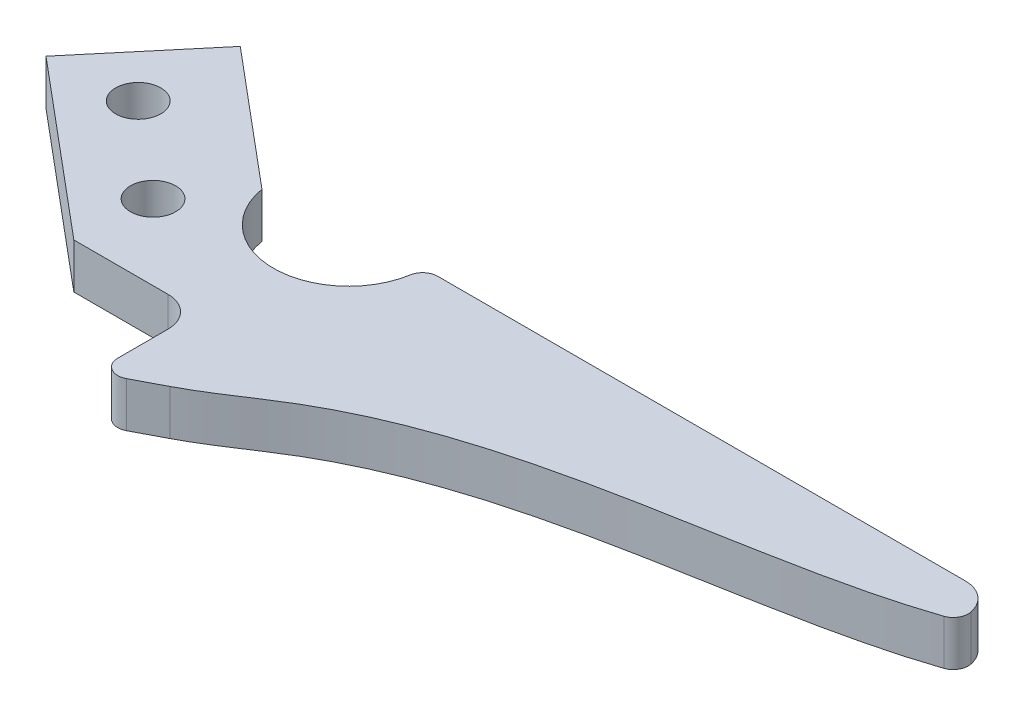
ISO-10303-21;
HEADER;
FILE_DESCRIPTION(('STEP AP214'),'2;1');
FILE_NAME('part.step','',(''),(''),'','','');
FILE_SCHEMA(('AUTOMOTIVE_DESIGN { 1 0 10303 214 1 1 1 1 }'));
ENDSEC;
DATA;
#1=APPLICATION_CONTEXT('core data for automotive mechanical design processes');
#2=APPLICATION_PROTOCOL_DEFINITION('international standard','automotive_design',2000,#1);
#3=PRODUCT_CONTEXT('',#1,'mechanical');
#4=PRODUCT('Part','Part','',(#3));
#5=PRODUCT_RELATED_PRODUCT_CATEGORY('part','',(#4));
#6=PRODUCT_DEFINITION_FORMATION('','',#4);
#7=PRODUCT_DEFINITION_CONTEXT('part definition',#1,'design');
#8=PRODUCT_DEFINITION('design','',#6,#7);
#9=PRODUCT_DEFINITION_SHAPE('','',#8);
#10=(LENGTH_UNIT() NAMED_UNIT(*) SI_UNIT(.MILLI.,.METRE.));
#11=(NAMED_UNIT(*) PLANE_ANGLE_UNIT() SI_UNIT($,.RADIAN.));
#12=(NAMED_UNIT(*) SI_UNIT($,.STERADIAN.) SOLID_ANGLE_UNIT());
#13=UNCERTAINTY_MEASURE_WITH_UNIT(LENGTH_MEASURE(1.E-05),#10,'distance_accuracy_value','');
#14=(GEOMETRIC_REPRESENTATION_CONTEXT(3) GLOBAL_UNCERTAINTY_ASSIGNED_CONTEXT((#13)) GLOBAL_UNIT_ASSIGNED_CONTEXT((#10,
#11,#12)) REPRESENTATION_CONTEXT('',''));
#15=CARTESIAN_POINT('',(0.,0.,0.));
#16=DIRECTION('',(0.,0.,1.));
#17=DIRECTION('',(1.,0.,0.));
#18=AXIS2_PLACEMENT_3D('',#15,#16,#17);
#19=CARTESIAN_POINT('',(13.,0.,5.34819795369593));
#20=DIRECTION('',(0.,1.,0.));
#21=DIRECTION('',(0.,0.,1.));
#22=AXIS2_PLACEMENT_3D('',#19,#20,#21);
#23=CYLINDRICAL_SURFACE('',#22,1.);
#24=DIRECTION('',(0.,1.,0.));
#25=VECTOR('',#24,1.);
#26=CARTESIAN_POINT('',(13.4635840631076,0.,6.23425089592493));
#27=LINE('',#26,#25);
#28=CARTESIAN_POINT('',(13.4635840631076,3.,6.23425089592493));
#29=VERTEX_POINT('',#28);
#30=CARTESIAN_POINT('',(13.4635840631076,0.,6.23425089592493));
#31=VERTEX_POINT('',#30);
#32=EDGE_CURVE('E208',#29,#31,#27,.F.);
#33=ORIENTED_EDGE('',*,*,#32,.F.);
#34=CARTESIAN_POINT('',(13.,3.,5.34819795369593));
#35=DIRECTION('',(0.,1.,0.));
#36=DIRECTION('',(0.,0.,1.));
#37=AXIS2_PLACEMENT_3D('',#34,#35,#36);
#38=CIRCLE('',#37,1.);
#39=CARTESIAN_POINT('',(12.,3.,5.34819795369593));
#40=VERTEX_POINT('',#39);
#41=EDGE_CURVE('E148',#40,#29,#38,.T.);
#42=ORIENTED_EDGE('',*,*,#41,.F.);
#43=DIRECTION('',(0.,1.,0.));
#44=VECTOR('',#43,1.);
#45=CARTESIAN_POINT('',(12.,0.,5.34819795369593));
#46=LINE('',#45,#44);
#47=CARTESIAN_POINT('',(12.,0.,5.34819795369593));
#48=VERTEX_POINT('',#47);
#49=EDGE_CURVE('E147',#48,#40,#46,.T.);
#50=ORIENTED_EDGE('',*,*,#49,.F.);
#51=CARTESIAN_POINT('',(13.,0.,5.34819795369593));
#52=DIRECTION('',(0.,1.,0.));
#53=DIRECTION('',(0.,0.,1.));
#54=AXIS2_PLACEMENT_3D('',#51,#52,#53);
#55=CIRCLE('',#54,1.);
#56=EDGE_CURVE('E130',#48,#31,#55,.T.);
#57=ORIENTED_EDGE('',*,*,#56,.T.);
#58=EDGE_LOOP('',(#33,#42,#50,#57));
#59=FACE_BOUND('',#58,.T.);
#60=ADVANCED_FACE('F36',(#59),#23,.T.);
#61=CARTESIAN_POINT('',(53.980656682762,0.,-8.19573571608667));
#62=DIRECTION('',(0.,1.,0.));
#63=DIRECTION('',(0.,0.,1.));
#64=AXIS2_PLACEMENT_3D('',#61,#62,#63);
#65=CYLINDRICAL_SURFACE('',#64,1.);
#66=CARTESIAN_POINT('',(53.980656682762,3.,-8.19573571608667));
#67=DIRECTION('',(0.,1.,0.));
#68=DIRECTION('',(0.,0.,1.));
#69=AXIS2_PLACEMENT_3D('',#66,#67,#68);
#70=CIRCLE('',#69,1.);
#71=CARTESIAN_POINT('',(54.3167919613056,3.,-7.25392200068515));
#72=VERTEX_POINT('',#71);
#73=CARTESIAN_POINT('',(54.9613133655257,3.,-8.39147143217367));
#74=VERTEX_POINT('',#73);
#75=EDGE_CURVE('E266',#72,#74,#70,.T.);
#76=ORIENTED_EDGE('',*,*,#75,.F.);
#77=DIRECTION('',(0.,1.,0.));
#78=VECTOR('',#77,1.);
#79=CARTESIAN_POINT('',(54.3167919613056,0.,-7.25392200068516));
#80=LINE('',#79,#78);
#81=CARTESIAN_POINT('',(54.3167919613056,0.,-7.25392200068515));
#82=VERTEX_POINT('',#81);
#83=EDGE_CURVE('E202',#82,#72,#80,.T.);
#84=ORIENTED_EDGE('',*,*,#83,.F.);
#85=CARTESIAN_POINT('',(53.980656682762,0.,-8.19573571608667));
#86=DIRECTION('',(0.,1.,0.));
#87=DIRECTION('',(0.,0.,1.));
#88=AXIS2_PLACEMENT_3D('',#85,#86,#87);
#89=CIRCLE('',#88,1.);
#90=CARTESIAN_POINT('',(54.9613133655257,0.,-8.39147143217367));
#91=VERTEX_POINT('',#90);
#92=EDGE_CURVE('E144',#82,#91,#89,.T.);
#93=ORIENTED_EDGE('',*,*,#92,.T.);
#94=DIRECTION('',(0.,1.,0.));
#95=VECTOR('',#94,1.);
#96=CARTESIAN_POINT('',(54.9613133655262,0.,-8.39147143217378));
#97=LINE('',#96,#95);
#98=EDGE_CURVE('E198',#74,#91,#97,.F.);
#99=ORIENTED_EDGE('',*,*,#98,.F.);
#100=EDGE_LOOP('',(#76,#84,#93,#99));
#101=FACE_BOUND('',#100,.T.);
#102=ADVANCED_FACE('F275',(#101),#65,.T.);
#103=CARTESIAN_POINT('',(17.9160797830996,0.,-9.00000000000001));
#104=DIRECTION('',(0.,1.,0.));
#105=DIRECTION('',(0.,0.,1.));
#106=AXIS2_PLACEMENT_3D('',#103,#104,#105);
#107=CYLINDRICAL_SURFACE('',#106,0.999999999999999);
#108=CARTESIAN_POINT('',(17.9160797830996,0.,-9.00000000000001));
#109=DIRECTION('',(0.,1.,0.));
#110=DIRECTION('',(0.,0.,1.));
#111=AXIS2_PLACEMENT_3D('',#108,#109,#110);
#112=CIRCLE('',#111,0.999999999999999);
#113=CARTESIAN_POINT('',(17.9160797830996,0.,-10.));
#114=VERTEX_POINT('',#113);
#115=CARTESIAN_POINT('',(16.9300664859163,0.,-9.16666666666667));
#116=VERTEX_POINT('',#115);
#117=EDGE_CURVE('E269',#114,#116,#112,.T.);
#118=ORIENTED_EDGE('',*,*,#117,.T.);
#119=DIRECTION('',(0.,1.,0.));
#120=VECTOR('',#119,1.);
#121=CARTESIAN_POINT('',(16.9300664859163,0.,-9.16666666666667));
#122=LINE('',#121,#120);
#123=CARTESIAN_POINT('',(16.9300664859163,3.,-9.16666666666667));
#124=VERTEX_POINT('',#123);
#125=EDGE_CURVE('E188',#116,#124,#122,.T.);
#126=ORIENTED_EDGE('',*,*,#125,.T.);
#127=CARTESIAN_POINT('',(17.9160797830996,3.,-9.00000000000001));
#128=DIRECTION('',(0.,1.,0.));
#129=DIRECTION('',(0.,0.,1.));
#130=AXIS2_PLACEMENT_3D('',#127,#128,#129);
#131=CIRCLE('',#130,0.999999999999999);
#132=CARTESIAN_POINT('',(17.9160797830996,3.,-10.));
#133=VERTEX_POINT('',#132);
#134=EDGE_CURVE('E263',#133,#124,#131,.T.);
#135=ORIENTED_EDGE('',*,*,#134,.F.);
#136=DIRECTION('',(0.,1.,0.));
#137=VECTOR('',#136,1.);
#138=CARTESIAN_POINT('',(17.9160797830996,0.,-10.));
#139=LINE('',#138,#137);
#140=EDGE_CURVE('E192',#114,#133,#139,.T.);
#141=ORIENTED_EDGE('',*,*,#140,.F.);
#142=EDGE_LOOP('',(#118,#126,#135,#141));
#143=FACE_BOUND('',#142,.T.);
#144=ADVANCED_FACE('F356',(#143),#107,.T.);
#145=CARTESIAN_POINT('',(12.2998821433564,3.,-124.980636425876));
#146=DIRECTION('',(0.,1.,0.));
#147=DIRECTION('',(0.,0.,1.));
#148=AXIS2_PLACEMENT_3D('',#145,#146,#147);
#149=PLANE('',#148);
#150=CARTESIAN_POINT('',(54.3167919613056,3.,-7.25392200068515));
#151=CARTESIAN_POINT('',(44.2301458392684,3.,-3.84651010442906));
#152=CARTESIAN_POINT('',(28.2149287341688,3.,-3.96201844889589));
#153=CARTESIAN_POINT('',(17.1935808302147,3.,4.2827116884323));
#154=CARTESIAN_POINT('',(15.3611622163812,3.,5.24143551387112));
#155=B_SPLINE_CURVE_WITH_KNOTS('',3,(#150,#151,#152,#153,#154),.UNSPECIFIED.,.F.,.F.,(4,1,4),
(0.,0.850928192848262,1.),.UNSPECIFIED.);
#156=CARTESIAN_POINT('',(15.3611622163812,3.,5.24143551387112));
#157=VERTEX_POINT('',#156);
#158=EDGE_CURVE('E145',#72,#157,#155,.T.);
#159=ORIENTED_EDGE('',*,*,#158,.F.);
#160=ORIENTED_EDGE('',*,*,#75,.T.);
#161=CARTESIAN_POINT('',(53.,3.,-8.));
#162=DIRECTION('',(0.,1.,0.));
#163=DIRECTION('',(0.,0.,1.));
#164=AXIS2_PLACEMENT_3D('',#161,#162,#163);
#165=CIRCLE('',#164,2.);
#166=CARTESIAN_POINT('',(53.,3.,-10.));
#167=VERTEX_POINT('',#166);
#168=EDGE_CURVE('E201',#167,#74,#165,.F.);
#169=ORIENTED_EDGE('',*,*,#168,.F.);
#170=DIRECTION('',(-1.,0.,0.));
#171=VECTOR('',#170,1.);
#172=CARTESIAN_POINT('',(53.,3.,-10.));
#173=LINE('',#172,#171);
#174=EDGE_CURVE('E195',#133,#167,#173,.F.);
#175=ORIENTED_EDGE('',*,*,#174,.F.);
#176=ORIENTED_EDGE('',*,*,#134,.T.);
#177=CARTESIAN_POINT('',(12.,3.,-10.));
#178=DIRECTION('',(0.,1.,0.));
#179=DIRECTION('',(0.,0.,1.));
#180=AXIS2_PLACEMENT_3D('',#177,#178,#179);
#181=CIRCLE('',#180,5.);
#182=CARTESIAN_POINT('',(7.06993351408365,3.,-9.16666666666667));
#183=VERTEX_POINT('',#182);
#184=EDGE_CURVE('E191',#124,#183,#181,.F.);
#185=ORIENTED_EDGE('',*,*,#184,.T.);
#186=DIRECTION('',(-0.766044443118997,0.,-0.642787609686517));
#187=VECTOR('',#186,1.);
#188=CARTESIAN_POINT('',(7.06993351408365,3.,-9.16666666666667));
#189=LINE('',#188,#187);
#190=CARTESIAN_POINT('',(-1.8724279217503,3.,-16.6701988493284));
#191=VERTEX_POINT('',#190);
#192=EDGE_CURVE('E177',#191,#183,#189,.F.);
#193=ORIENTED_EDGE('',*,*,#192,.F.);
#194=DIRECTION('',(-0.642787609686517,0.,0.766044443118997));
#195=VECTOR('',#194,1.);
#196=CARTESIAN_POINT('',(-1.8724279217503,3.,-16.6701988493284));
#197=LINE('',#196,#195);
#198=CARTESIAN_POINT('',(-7.76368375617389,3.,-9.6492735437621));
#199=VERTEX_POINT('',#198);
#200=EDGE_CURVE('E185',#199,#191,#197,.F.);
#201=ORIENTED_EDGE('',*,*,#200,.F.);
#202=DIRECTION('',(-0.766044443118997,0.,-0.642787609686517));
#203=VECTOR('',#202,1.);
#204=CARTESIAN_POINT('',(3.73587265552954,3.,0.));
#205=LINE('',#204,#203);
#206=CARTESIAN_POINT('',(3.73587265552957,3.,0.));
#207=VERTEX_POINT('',#206);
#208=EDGE_CURVE('E171',#199,#207,#205,.F.);
#209=ORIENTED_EDGE('',*,*,#208,.T.);
#210=DIRECTION('',(1.,0.,0.));
#211=VECTOR('',#210,1.);
#212=CARTESIAN_POINT('',(-8.,3.,0.));
#213=LINE('',#212,#211);
#214=CARTESIAN_POINT('',(9.99999999999999,3.,0.));
#215=VERTEX_POINT('',#214);
#216=EDGE_CURVE('E215',#215,#207,#213,.F.);
#217=ORIENTED_EDGE('',*,*,#216,.F.);
#218=CARTESIAN_POINT('',(9.99999999999999,3.,2.));
#219=DIRECTION('',(0.,-1.,0.));
#220=DIRECTION('',(0.,0.,-1.));
#221=AXIS2_PLACEMENT_3D('',#218,#219,#220);
#222=CIRCLE('',#221,2.);
#223=CARTESIAN_POINT('',(12.,3.,2.));
#224=VERTEX_POINT('',#223);
#225=EDGE_CURVE('E152',#215,#224,#222,.T.);
#226=ORIENTED_EDGE('',*,*,#225,.T.);
#227=DIRECTION('',(0.,0.,1.));
#228=VECTOR('',#227,1.);
#229=CARTESIAN_POINT('',(12.,3.,0.));
#230=LINE('',#229,#228);
#231=EDGE_CURVE('E151',#40,#224,#230,.F.);
#232=ORIENTED_EDGE('',*,*,#231,.F.);
#233=ORIENTED_EDGE('',*,*,#41,.T.);
#234=DIRECTION('',(0.886052942228994,0.,-0.463584063107591));
#235=VECTOR('',#234,1.);
#236=CARTESIAN_POINT('',(12.,3.,7.));
#237=LINE('',#236,#235);
#238=EDGE_CURVE('E210',#157,#29,#237,.F.);
#239=ORIENTED_EDGE('',*,*,#238,.F.);
#240=EDGE_LOOP('',(#159,#160,#169,#175,#176,#185,#193,#201,#209,#217,#226,#232,#233,#239));
#241=FACE_BOUND('',#240,.T.);
#242=CARTESIAN_POINT('',(4.,3.,-5.));
#243=DIRECTION('',(0.,1.,0.));
#244=DIRECTION('',(0.,0.,1.));
#245=AXIS2_PLACEMENT_3D('',#242,#243,#244);
#246=CIRCLE('',#245,1.5);
#247=CARTESIAN_POINT('',(4.,3.,-3.5));
#248=VERTEX_POINT('',#247);
#249=EDGE_CURVE('E224',#248,#248,#246,.F.);
#250=ORIENTED_EDGE('',*,*,#249,.T.);
#251=EDGE_LOOP('',(#250));
#252=FACE_BOUND('',#251,.T.);
#253=CARTESIAN_POINT('',(-2.12835554495197,3.,-10.1423008774921));
#254=DIRECTION('',(0.,-1.,0.));
#255=DIRECTION('',(0.,0.,-1.));
#256=AXIS2_PLACEMENT_3D('',#253,#254,#255);
#257=CIRCLE('',#256,1.5);
#258=CARTESIAN_POINT('',(-2.12835554495197,3.,-11.6423008774921));
#259=VERTEX_POINT('',#258);
#260=EDGE_CURVE('E260',#259,#259,#257,.T.);
#261=ORIENTED_EDGE('',*,*,#260,.T.);
#262=EDGE_LOOP('',(#261));
#263=FACE_BOUND('',#262,.T.);
#264=ADVANCED_FACE('F352',(#241,#252,#263),#149,.T.);
#265=CARTESIAN_POINT('',(-2.12835554495197,3.,-10.1423008774921));
#266=DIRECTION('',(0.,-1.,0.));
#267=DIRECTION('',(0.,0.,-1.));
#268=AXIS2_PLACEMENT_3D('',#265,#266,#267);
#269=CYLINDRICAL_SURFACE('',#268,1.5);
#270=ORIENTED_EDGE('',*,*,#260,.F.);
#271=EDGE_LOOP('',(#270));
#272=FACE_BOUND('',#271,.T.);
#273=CARTESIAN_POINT('',(-2.12835554495197,0.,-10.1423008774921));
#274=DIRECTION('',(0.,-1.,0.));
#275=DIRECTION('',(0.,0.,-1.));
#276=AXIS2_PLACEMENT_3D('',#273,#274,#275);
#277=CIRCLE('',#276,1.5);
#278=CARTESIAN_POINT('',(-2.12835554495197,0.,-11.6423008774921));
#279=VERTEX_POINT('',#278);
#280=EDGE_CURVE('E229',#279,#279,#277,.T.);
#281=ORIENTED_EDGE('',*,*,#280,.T.);
#282=EDGE_LOOP('',(#281));
#283=FACE_BOUND('',#282,.T.);
#284=ADVANCED_FACE('F348',(#272,#283),#269,.F.);
#285=CARTESIAN_POINT('',(4.,0.,-5.));
#286=DIRECTION('',(0.,1.,0.));
#287=DIRECTION('',(0.,0.,1.));
#288=AXIS2_PLACEMENT_3D('',#285,#286,#287);
#289=CYLINDRICAL_SURFACE('',#288,1.5);
#290=CARTESIAN_POINT('',(4.,0.,-5.));
#291=DIRECTION('',(0.,1.,0.));
#292=DIRECTION('',(0.,0.,1.));
#293=AXIS2_PLACEMENT_3D('',#290,#291,#292);
#294=CIRCLE('',#293,1.5);
#295=CARTESIAN_POINT('',(4.,0.,-3.5));
#296=VERTEX_POINT('',#295);
#297=EDGE_CURVE('E167',#296,#296,#294,.F.);
#298=ORIENTED_EDGE('',*,*,#297,.T.);
#299=EDGE_LOOP('',(#298));
#300=FACE_BOUND('',#299,.T.);
#301=ORIENTED_EDGE('',*,*,#249,.F.);
#302=EDGE_LOOP('',(#301));
#303=FACE_BOUND('',#302,.T.);
#304=ADVANCED_FACE('F344',(#300,#303),#289,.F.);
#305=CARTESIAN_POINT('',(-8.,0.,0.));
#306=DIRECTION('',(0.,0.,1.));
#307=DIRECTION('',(1.,0.,0.));
#308=AXIS2_PLACEMENT_3D('',#305,#306,#307);
#309=PLANE('',#308);
#310=DIRECTION('',(0.,-1.,0.));
#311=VECTOR('',#310,1.);
#312=CARTESIAN_POINT('',(9.99999999999999,0.,0.));
#313=LINE('',#312,#311);
#314=CARTESIAN_POINT('',(9.99999999999999,0.,0.));
#315=VERTEX_POINT('',#314);
#316=EDGE_CURVE('E212',#315,#215,#313,.F.);
#317=ORIENTED_EDGE('',*,*,#316,.T.);
#318=ORIENTED_EDGE('',*,*,#216,.T.);
#319=DIRECTION('',(0.,1.,0.));
#320=VECTOR('',#319,1.);
#321=CARTESIAN_POINT('',(3.73587265552956,3.,0.));
#322=LINE('',#321,#320);
#323=CARTESIAN_POINT('',(3.73587265552956,0.,0.));
#324=VERTEX_POINT('',#323);
#325=EDGE_CURVE('E172',#207,#324,#322,.F.);
#326=ORIENTED_EDGE('',*,*,#325,.T.);
#327=DIRECTION('',(1.,0.,0.));
#328=VECTOR('',#327,1.);
#329=CARTESIAN_POINT('',(12.2998821433564,0.,0.));
#330=LINE('',#329,#328);
#331=EDGE_CURVE('E161',#324,#315,#330,.T.);
#332=ORIENTED_EDGE('',*,*,#331,.T.);
#333=EDGE_LOOP('',(#317,#318,#326,#332));
#334=FACE_BOUND('',#333,.T.);
#335=ADVANCED_FACE('F340',(#334),#309,.T.);
#336=CARTESIAN_POINT('',(9.99999999999999,0.,2.));
#337=DIRECTION('',(0.,-1.,0.));
#338=DIRECTION('',(0.,0.,-1.));
#339=AXIS2_PLACEMENT_3D('',#336,#337,#338);
#340=CYLINDRICAL_SURFACE('',#339,2.);
#341=DIRECTION('',(0.,1.,0.));
#342=VECTOR('',#341,1.);
#343=CARTESIAN_POINT('',(12.,0.,2.));
#344=LINE('',#343,#342);
#345=CARTESIAN_POINT('',(12.,0.,2.));
#346=VERTEX_POINT('',#345);
#347=EDGE_CURVE('E156',#224,#346,#344,.F.);
#348=ORIENTED_EDGE('',*,*,#347,.F.);
#349=ORIENTED_EDGE('',*,*,#225,.F.);
#350=ORIENTED_EDGE('',*,*,#316,.F.);
#351=CARTESIAN_POINT('',(9.99999999999999,0.,2.));
#352=DIRECTION('',(0.,-1.,0.));
#353=DIRECTION('',(0.,0.,-1.));
#354=AXIS2_PLACEMENT_3D('',#351,#352,#353);
#355=CIRCLE('',#354,2.);
#356=EDGE_CURVE('E157',#315,#346,#355,.T.);
#357=ORIENTED_EDGE('',*,*,#356,.T.);
#358=EDGE_LOOP('',(#348,#349,#350,#357));
#359=FACE_BOUND('',#358,.T.);
#360=ADVANCED_FACE('F337',(#359),#340,.F.);
#361=CARTESIAN_POINT('',(12.,0.,0.));
#362=DIRECTION('',(-1.,0.,0.));
#363=DIRECTION('',(0.,0.,1.));
#364=AXIS2_PLACEMENT_3D('',#361,#362,#363);
#365=PLANE('',#364);
#366=ORIENTED_EDGE('',*,*,#231,.T.);
#367=ORIENTED_EDGE('',*,*,#347,.T.);
#368=DIRECTION('',(0.,0.,1.));
#369=VECTOR('',#368,1.);
#370=CARTESIAN_POINT('',(12.,0.,-124.980636425876));
#371=LINE('',#370,#369);
#372=EDGE_CURVE('E140',#346,#48,#371,.T.);
#373=ORIENTED_EDGE('',*,*,#372,.T.);
#374=ORIENTED_EDGE('',*,*,#49,.T.);
#375=EDGE_LOOP('',(#366,#367,#373,#374));
#376=FACE_BOUND('',#375,.T.);
#377=ADVANCED_FACE('F154',(#376),#365,.T.);
#378=CARTESIAN_POINT('',(12.,0.,7.));
#379=DIRECTION('',(0.463584063107591,0.,0.886052942228994));
#380=DIRECTION('',(0.886052942228994,0.,-0.463584063107591));
#381=AXIS2_PLACEMENT_3D('',#378,#379,#380);
#382=PLANE('',#381);
#383=ORIENTED_EDGE('',*,*,#238,.T.);
#384=ORIENTED_EDGE('',*,*,#32,.T.);
#385=DIRECTION('',(0.886052942228991,0.,-0.463584063107598));
#386=VECTOR('',#385,1.);
#387=CARTESIAN_POINT('',(13.4635840631076,0.,6.23425089592494));
#388=LINE('',#387,#386);
#389=CARTESIAN_POINT('',(15.3611622163811,0.,5.24143551387117));
#390=VERTEX_POINT('',#389);
#391=EDGE_CURVE('E143',#31,#390,#388,.T.);
#392=ORIENTED_EDGE('',*,*,#391,.T.);
#393=DIRECTION('',(0.,1.,0.));
#394=VECTOR('',#393,1.);
#395=CARTESIAN_POINT('',(15.3611622163811,0.,5.24143551387094));
#396=LINE('',#395,#394);
#397=EDGE_CURVE('E205',#390,#157,#396,.T.);
#398=ORIENTED_EDGE('',*,*,#397,.T.);
#399=EDGE_LOOP('',(#383,#384,#392,#398));
#400=FACE_BOUND('',#399,.T.);
#401=ADVANCED_FACE('F331',(#400),#382,.T.);
#402=CARTESIAN_POINT('',(53.,0.,-8.));
#403=DIRECTION('',(0.,1.,0.));
#404=DIRECTION('',(0.,0.,1.));
#405=AXIS2_PLACEMENT_3D('',#402,#403,#404);
#406=CYLINDRICAL_SURFACE('',#405,2.);
#407=CARTESIAN_POINT('',(53.,0.,-8.));
#408=DIRECTION('',(0.,1.,0.));
#409=DIRECTION('',(0.,0.,1.));
#410=AXIS2_PLACEMENT_3D('',#407,#408,#409);
#411=CIRCLE('',#410,2.);
#412=CARTESIAN_POINT('',(53.,0.,-10.));
#413=VERTEX_POINT('',#412);
#414=EDGE_CURVE('E159',#91,#413,#411,.T.);
#415=ORIENTED_EDGE('',*,*,#414,.T.);
#416=DIRECTION('',(0.,1.,0.));
#417=VECTOR('',#416,1.);
#418=CARTESIAN_POINT('',(53.,0.,-10.));
#419=LINE('',#418,#417);
#420=EDGE_CURVE('E193',#167,#413,#419,.F.);
#421=ORIENTED_EDGE('',*,*,#420,.F.);
#422=ORIENTED_EDGE('',*,*,#168,.T.);
#423=ORIENTED_EDGE('',*,*,#98,.T.);
#424=EDGE_LOOP('',(#415,#421,#422,#423));
#425=FACE_BOUND('',#424,.T.);
#426=ADVANCED_FACE('F278',(#425),#406,.T.);
#427=CARTESIAN_POINT('',(53.,0.,-10.));
#428=DIRECTION('',(0.,0.,-1.));
#429=DIRECTION('',(-1.,0.,0.));
#430=AXIS2_PLACEMENT_3D('',#427,#428,#429);
#431=PLANE('',#430);
#432=DIRECTION('',(1.,0.,0.));
#433=VECTOR('',#432,1.);
#434=CARTESIAN_POINT('',(12.2998821433564,0.,-9.99999999999999));
#435=LINE('',#434,#433);
#436=EDGE_CURVE('E245',#413,#114,#435,.F.);
#437=ORIENTED_EDGE('',*,*,#436,.T.);
#438=ORIENTED_EDGE('',*,*,#140,.T.);
#439=ORIENTED_EDGE('',*,*,#174,.T.);
#440=ORIENTED_EDGE('',*,*,#420,.T.);
#441=EDGE_LOOP('',(#437,#438,#439,#440));
#442=FACE_BOUND('',#441,.T.);
#443=ADVANCED_FACE('F325',(#442),#431,.T.);
#444=CARTESIAN_POINT('',(12.,0.,-10.));
#445=DIRECTION('',(0.,1.,0.));
#446=DIRECTION('',(0.,0.,1.));
#447=AXIS2_PLACEMENT_3D('',#444,#445,#446);
#448=CYLINDRICAL_SURFACE('',#447,5.);
#449=CARTESIAN_POINT('',(12.,0.,-10.));
#450=DIRECTION('',(0.,1.,0.));
#451=DIRECTION('',(0.,0.,1.));
#452=AXIS2_PLACEMENT_3D('',#449,#450,#451);
#453=CIRCLE('',#452,5.);
#454=CARTESIAN_POINT('',(7.06993351408365,0.,-9.16666666666667));
#455=VERTEX_POINT('',#454);
#456=EDGE_CURVE('E243',#116,#455,#453,.F.);
#457=ORIENTED_EDGE('',*,*,#456,.T.);
#458=DIRECTION('',(0.,1.,0.));
#459=VECTOR('',#458,1.);
#460=CARTESIAN_POINT('',(7.06993351408365,3.,-9.16666666666667));
#461=LINE('',#460,#459);
#462=EDGE_CURVE('E173',#183,#455,#461,.F.);
#463=ORIENTED_EDGE('',*,*,#462,.F.);
#464=ORIENTED_EDGE('',*,*,#184,.F.);
#465=ORIENTED_EDGE('',*,*,#125,.F.);
#466=EDGE_LOOP('',(#457,#463,#464,#465));
#467=FACE_BOUND('',#466,.T.);
#468=ADVANCED_FACE('F321',(#467),#448,.F.);
#469=CARTESIAN_POINT('',(7.06993351408365,3.,-9.16666666666667));
#470=DIRECTION('',(0.642787609686517,0.,-0.766044443118997));
#471=DIRECTION('',(-0.766044443118997,0.,-0.642787609686517));
#472=AXIS2_PLACEMENT_3D('',#469,#470,#471);
#473=PLANE('',#472);
#474=DIRECTION('',(-0.766044443118997,0.,-0.642787609686517));
#475=VECTOR('',#474,1.);
#476=CARTESIAN_POINT('',(7.06993351408365,0.,-9.16666666666667));
#477=LINE('',#476,#475);
#478=CARTESIAN_POINT('',(-1.8724279217503,0.,-16.6701988493284));
#479=VERTEX_POINT('',#478);
#480=EDGE_CURVE('E181',#455,#479,#477,.T.);
#481=ORIENTED_EDGE('',*,*,#480,.T.);
#482=DIRECTION('',(0.,1.,0.));
#483=VECTOR('',#482,1.);
#484=CARTESIAN_POINT('',(-1.8724279217503,3.,-16.6701988493284));
#485=LINE('',#484,#483);
#486=EDGE_CURVE('E176',#191,#479,#485,.F.);
#487=ORIENTED_EDGE('',*,*,#486,.F.);
#488=ORIENTED_EDGE('',*,*,#192,.T.);
#489=ORIENTED_EDGE('',*,*,#462,.T.);
#490=EDGE_LOOP('',(#481,#487,#488,#489));
#491=FACE_BOUND('',#490,.T.);
#492=ADVANCED_FACE('F317',(#491),#473,.T.);
#493=CARTESIAN_POINT('',(-1.8724279217503,3.,-16.6701988493284));
#494=DIRECTION('',(-0.766044443118997,0.,-0.642787609686517));
#495=DIRECTION('',(-0.642787609686517,0.,0.766044443118997));
#496=AXIS2_PLACEMENT_3D('',#493,#494,#495);
#497=PLANE('',#496);
#498=DIRECTION('',(0.,1.,0.));
#499=VECTOR('',#498,1.);
#500=CARTESIAN_POINT('',(-7.76368375617389,3.,-9.6492735437621));
#501=LINE('',#500,#499);
#502=CARTESIAN_POINT('',(-7.76368375617389,0.,-9.6492735437621));
#503=VERTEX_POINT('',#502);
#504=EDGE_CURVE('E54',#503,#199,#501,.T.);
#505=ORIENTED_EDGE('',*,*,#504,.T.);
#506=ORIENTED_EDGE('',*,*,#200,.T.);
#507=ORIENTED_EDGE('',*,*,#486,.T.);
#508=DIRECTION('',(-0.642787609686518,0.,0.766044443118996));
#509=VECTOR('',#508,1.);
#510=CARTESIAN_POINT('',(-1.8724279217503,0.,-16.6701988493284));
#511=LINE('',#510,#509);
#512=EDGE_CURVE('E178',#479,#503,#511,.T.);
#513=ORIENTED_EDGE('',*,*,#512,.T.);
#514=EDGE_LOOP('',(#505,#506,#507,#513));
#515=FACE_BOUND('',#514,.T.);
#516=ADVANCED_FACE('F314',(#515),#497,.T.);
#517=CARTESIAN_POINT('',(3.73587265552954,3.,0.));
#518=DIRECTION('',(0.642787609686517,0.,-0.766044443118997));
#519=DIRECTION('',(-0.766044443118997,0.,-0.642787609686517));
#520=AXIS2_PLACEMENT_3D('',#517,#518,#519);
#521=PLANE('',#520);
#522=ORIENTED_EDGE('',*,*,#504,.F.);
#523=DIRECTION('',(0.766044443118997,0.,0.642787609686517));
#524=VECTOR('',#523,1.);
#525=CARTESIAN_POINT('',(-7.76368375617389,0.,-9.6492735437621));
#526=LINE('',#525,#524);
#527=EDGE_CURVE('E46',#503,#324,#526,.T.);
#528=ORIENTED_EDGE('',*,*,#527,.T.);
#529=ORIENTED_EDGE('',*,*,#325,.F.);
#530=ORIENTED_EDGE('',*,*,#208,.F.);
#531=EDGE_LOOP('',(#522,#528,#529,#530));
#532=FACE_BOUND('',#531,.T.);
#533=ADVANCED_FACE('F311',(#532),#521,.F.);
#534=CARTESIAN_POINT('',(12.2998821433564,0.,-124.980636425876));
#535=DIRECTION('',(0.,1.,0.));
#536=DIRECTION('',(0.,0.,1.));
#537=AXIS2_PLACEMENT_3D('',#534,#535,#536);
#538=PLANE('',#537);
#539=ORIENTED_EDGE('',*,*,#92,.F.);
#540=CARTESIAN_POINT('',(54.3167919613056,0.,-7.25392200068515));
#541=CARTESIAN_POINT('',(44.2301458392684,0.,-3.84651010442906));
#542=CARTESIAN_POINT('',(28.2149287341688,0.,-3.96201844889589));
#543=CARTESIAN_POINT('',(17.1935808302147,0.,4.2827116884323));
#544=CARTESIAN_POINT('',(15.3611622163812,0.,5.24143551387112));
#545=B_SPLINE_CURVE_WITH_KNOTS('',3,(#540,#541,#542,#543,#544),.UNSPECIFIED.,.F.,.F.,(4,1,4),
(0.,0.850928192848262,1.),.UNSPECIFIED.);
#546=EDGE_CURVE('E11',#82,#390,#545,.T.);
#547=ORIENTED_EDGE('',*,*,#546,.T.);
#548=ORIENTED_EDGE('',*,*,#391,.F.);
#549=ORIENTED_EDGE('',*,*,#56,.F.);
#550=ORIENTED_EDGE('',*,*,#372,.F.);
#551=ORIENTED_EDGE('',*,*,#356,.F.);
#552=ORIENTED_EDGE('',*,*,#331,.F.);
#553=ORIENTED_EDGE('',*,*,#527,.F.);
#554=ORIENTED_EDGE('',*,*,#512,.F.);
#555=ORIENTED_EDGE('',*,*,#480,.F.);
#556=ORIENTED_EDGE('',*,*,#456,.F.);
#557=ORIENTED_EDGE('',*,*,#117,.F.);
#558=ORIENTED_EDGE('',*,*,#436,.F.);
#559=ORIENTED_EDGE('',*,*,#414,.F.);
#560=EDGE_LOOP('',(#539,#547,#548,#549,#550,#551,#552,#553,#554,#555,#556,#557,#558,#559));
#561=FACE_BOUND('',#560,.T.);
#562=ORIENTED_EDGE('',*,*,#297,.F.);
#563=EDGE_LOOP('',(#562));
#564=FACE_BOUND('',#563,.T.);
#565=ORIENTED_EDGE('',*,*,#280,.F.);
#566=EDGE_LOOP('',(#565));
#567=FACE_BOUND('',#566,.T.);
#568=ADVANCED_FACE('F136',(#561,#564,#567),#538,.F.);
#569=CARTESIAN_POINT('',(54.3167919613056,-7.,-7.25392200068515));
#570=CARTESIAN_POINT('',(44.2301458392684,-7.,-3.84651010442906));
#571=CARTESIAN_POINT('',(28.2149287341688,-7.,-3.96201844889589));
#572=CARTESIAN_POINT('',(17.1935808302147,-7.,4.2827116884323));
#573=CARTESIAN_POINT('',(15.3611622163812,-7.,5.24143551387112));
#574=B_SPLINE_CURVE_WITH_KNOTS('',3,(#569,#570,#571,#572,#573),.UNSPECIFIED.,.F.,.F.,(4,1,4),
(0.,0.850928192848262,1.),.UNSPECIFIED.);
#575=DIRECTION('',(0.,1.,0.));
#576=VECTOR('',#575,1.);
#577=SURFACE_OF_LINEAR_EXTRUSION('',#574,#576);
#578=ORIENTED_EDGE('',*,*,#83,.T.);
#579=ORIENTED_EDGE('',*,*,#158,.T.);
#580=ORIENTED_EDGE('',*,*,#397,.F.);
#581=ORIENTED_EDGE('',*,*,#546,.F.);
#582=EDGE_LOOP('',(#578,#579,#580,#581));
#583=FACE_BOUND('',#582,.T.);
#584=ADVANCED_FACE('F305',(#583),#577,.F.);
#585=CLOSED_SHELL('',(#60,#102,#144,#264,#284,#304,#335,#360,#377,#401,#426,#443,#468,#492,#516,
#533,#568,#584));
#586=MANIFOLD_SOLID_BREP('B2',#585);
#587=ADVANCED_BREP_SHAPE_REPRESENTATION('',(#18,#586),#14);
#588=SHAPE_DEFINITION_REPRESENTATION(#9,#587);
ENDSEC;
END-ISO-10303-21;
